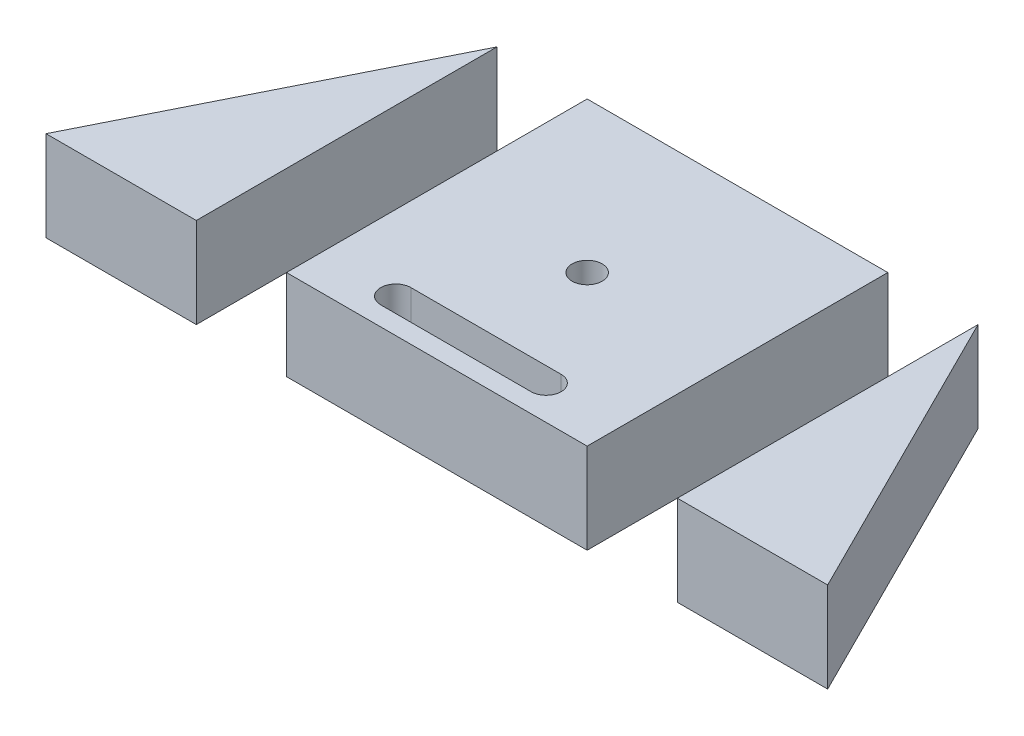
ISO-10303-21;
HEADER;
FILE_DESCRIPTION(('STEP AP214'),'2;1');
FILE_NAME('part.step','',(''),(''),'','','');
FILE_SCHEMA(('AUTOMOTIVE_DESIGN { 1 0 10303 214 1 1 1 1 }'));
ENDSEC;
DATA;
#1=APPLICATION_CONTEXT('core data for automotive mechanical design processes');
#2=APPLICATION_PROTOCOL_DEFINITION('international standard','automotive_design',2000,#1);
#3=PRODUCT_CONTEXT('',#1,'mechanical');
#4=PRODUCT('Part','Part','',(#3));
#5=PRODUCT_RELATED_PRODUCT_CATEGORY('part','',(#4));
#6=PRODUCT_DEFINITION_FORMATION('','',#4);
#7=PRODUCT_DEFINITION_CONTEXT('part definition',#1,'design');
#8=PRODUCT_DEFINITION('design','',#6,#7);
#9=PRODUCT_DEFINITION_SHAPE('','',#8);
#10=(LENGTH_UNIT() NAMED_UNIT(*) SI_UNIT(.MILLI.,.METRE.));
#11=(NAMED_UNIT(*) PLANE_ANGLE_UNIT() SI_UNIT($,.RADIAN.));
#12=(NAMED_UNIT(*) SI_UNIT($,.STERADIAN.) SOLID_ANGLE_UNIT());
#13=UNCERTAINTY_MEASURE_WITH_UNIT(LENGTH_MEASURE(1.E-05),#10,'distance_accuracy_value','');
#14=(GEOMETRIC_REPRESENTATION_CONTEXT(3) GLOBAL_UNCERTAINTY_ASSIGNED_CONTEXT((#13)) GLOBAL_UNIT_ASSIGNED_CONTEXT((#10,
#11,#12)) REPRESENTATION_CONTEXT('',''));
#15=CARTESIAN_POINT('',(0.,0.,0.));
#16=DIRECTION('',(0.,0.,1.));
#17=DIRECTION('',(1.,0.,0.));
#18=AXIS2_PLACEMENT_3D('',#15,#16,#17);
#19=CARTESIAN_POINT('',(-80.,30.,-50.));
#20=DIRECTION('',(-1.,0.,0.));
#21=DIRECTION('',(0.,0.,-1.));
#22=AXIS2_PLACEMENT_3D('',#19,#20,#21);
#23=PLANE('',#22);
#24=DIRECTION('',(0.,0.,1.));
#25=VECTOR('',#24,1.);
#26=CARTESIAN_POINT('',(-80.,0.,-50.));
#27=LINE('',#26,#25);
#28=CARTESIAN_POINT('',(-80.,0.,-50.));
#29=VERTEX_POINT('',#28);
#30=CARTESIAN_POINT('',(-80.,0.,50.));
#31=VERTEX_POINT('',#30);
#32=EDGE_CURVE('E12',#29,#31,#27,.T.);
#33=ORIENTED_EDGE('',*,*,#32,.F.);
#34=DIRECTION('',(0.,-1.,0.));
#35=VECTOR('',#34,1.);
#36=CARTESIAN_POINT('',(-80.,30.,-50.));
#37=LINE('',#36,#35);
#38=CARTESIAN_POINT('',(-80.,30.,-50.));
#39=VERTEX_POINT('',#38);
#40=EDGE_CURVE('E95',#39,#29,#37,.T.);
#41=ORIENTED_EDGE('',*,*,#40,.F.);
#42=DIRECTION('',(0.,0.,1.));
#43=VECTOR('',#42,1.);
#44=CARTESIAN_POINT('',(-80.,30.,-50.));
#45=LINE('',#44,#43);
#46=CARTESIAN_POINT('',(-80.,30.,50.));
#47=VERTEX_POINT('',#46);
#48=EDGE_CURVE('E54',#39,#47,#45,.T.);
#49=ORIENTED_EDGE('',*,*,#48,.T.);
#50=DIRECTION('',(0.,-1.,0.));
#51=VECTOR('',#50,1.);
#52=CARTESIAN_POINT('',(-80.,30.,50.));
#53=LINE('',#52,#51);
#54=EDGE_CURVE('E101',#47,#31,#53,.T.);
#55=ORIENTED_EDGE('',*,*,#54,.T.);
#56=EDGE_LOOP('',(#33,#41,#49,#55));
#57=FACE_BOUND('',#56,.T.);
#58=ADVANCED_FACE('F50',(#57),#23,.F.);
#59=CARTESIAN_POINT('',(-80.,30.,50.));
#60=DIRECTION('',(0.,0.,-1.));
#61=DIRECTION('',(1.,0.,0.));
#62=AXIS2_PLACEMENT_3D('',#59,#60,#61);
#63=PLANE('',#62);
#64=DIRECTION('',(-1.,0.,0.));
#65=VECTOR('',#64,1.);
#66=CARTESIAN_POINT('',(-80.,0.,50.));
#67=LINE('',#66,#65);
#68=CARTESIAN_POINT('',(-130.,0.,50.));
#69=VERTEX_POINT('',#68);
#70=EDGE_CURVE('E60',#31,#69,#67,.T.);
#71=ORIENTED_EDGE('',*,*,#70,.F.);
#72=ORIENTED_EDGE('',*,*,#54,.F.);
#73=DIRECTION('',(-1.,0.,0.));
#74=VECTOR('',#73,1.);
#75=CARTESIAN_POINT('',(-80.,30.,50.));
#76=LINE('',#75,#74);
#77=CARTESIAN_POINT('',(-130.,30.,50.));
#78=VERTEX_POINT('',#77);
#79=EDGE_CURVE('E85',#47,#78,#76,.T.);
#80=ORIENTED_EDGE('',*,*,#79,.T.);
#81=DIRECTION('',(0.,-1.,0.));
#82=VECTOR('',#81,1.);
#83=CARTESIAN_POINT('',(-130.,30.,50.));
#84=LINE('',#83,#82);
#85=EDGE_CURVE('E99',#78,#69,#84,.T.);
#86=ORIENTED_EDGE('',*,*,#85,.T.);
#87=EDGE_LOOP('',(#71,#72,#80,#86));
#88=FACE_BOUND('',#87,.T.);
#89=ADVANCED_FACE('F106',(#88),#63,.F.);
#90=CARTESIAN_POINT('',(-130.,30.,50.));
#91=DIRECTION('',(0.894427190999916,0.,0.447213595499958));
#92=DIRECTION('',(-0.447213595499958,0.,0.894427190999916));
#93=AXIS2_PLACEMENT_3D('',#90,#91,#92);
#94=PLANE('',#93);
#95=DIRECTION('',(0.447213595499958,0.,-0.894427190999916));
#96=VECTOR('',#95,1.);
#97=CARTESIAN_POINT('',(-130.,0.,50.));
#98=LINE('',#97,#96);
#99=EDGE_CURVE('E88',#69,#29,#98,.T.);
#100=ORIENTED_EDGE('',*,*,#99,.F.);
#101=ORIENTED_EDGE('',*,*,#85,.F.);
#102=DIRECTION('',(0.447213595499958,0.,-0.894427190999916));
#103=VECTOR('',#102,1.);
#104=CARTESIAN_POINT('',(-130.,30.,50.));
#105=LINE('',#104,#103);
#106=EDGE_CURVE('E82',#78,#39,#105,.T.);
#107=ORIENTED_EDGE('',*,*,#106,.T.);
#108=ORIENTED_EDGE('',*,*,#40,.T.);
#109=EDGE_LOOP('',(#100,#101,#107,#108));
#110=FACE_BOUND('',#109,.T.);
#111=ADVANCED_FACE('F96',(#110),#94,.F.);
#112=CARTESIAN_POINT('',(0.,30.,0.));
#113=DIRECTION('',(0.,1.,0.));
#114=DIRECTION('',(0.,0.,1.));
#115=AXIS2_PLACEMENT_3D('',#112,#113,#114);
#116=PLANE('',#115);
#117=ORIENTED_EDGE('',*,*,#48,.F.);
#118=ORIENTED_EDGE('',*,*,#106,.F.);
#119=ORIENTED_EDGE('',*,*,#79,.F.);
#120=EDGE_LOOP('',(#117,#118,#119));
#121=FACE_BOUND('',#120,.T.);
#122=ADVANCED_FACE('F52',(#121),#116,.T.);
#123=CARTESIAN_POINT('',(0.,0.,0.));
#124=DIRECTION('',(0.,1.,0.));
#125=DIRECTION('',(0.,0.,1.));
#126=AXIS2_PLACEMENT_3D('',#123,#124,#125);
#127=PLANE('',#126);
#128=ORIENTED_EDGE('',*,*,#32,.T.);
#129=ORIENTED_EDGE('',*,*,#70,.T.);
#130=ORIENTED_EDGE('',*,*,#99,.T.);
#131=EDGE_LOOP('',(#128,#129,#130));
#132=FACE_BOUND('',#131,.T.);
#133=ADVANCED_FACE('F90',(#132),#127,.F.);
#134=CLOSED_SHELL('',(#58,#89,#111,#122,#133));
#135=MANIFOLD_SOLID_BREP('B2',#134);
#136=CARTESIAN_POINT('',(80.,30.,-50.));
#137=DIRECTION('',(1.,0.,0.));
#138=DIRECTION('',(0.,0.,-1.));
#139=AXIS2_PLACEMENT_3D('',#136,#137,#138);
#140=PLANE('',#139);
#141=DIRECTION('',(0.,0.,1.));
#142=VECTOR('',#141,1.);
#143=CARTESIAN_POINT('',(80.,0.,-50.));
#144=LINE('',#143,#142);
#145=CARTESIAN_POINT('',(80.,0.,-50.));
#146=VERTEX_POINT('',#145);
#147=CARTESIAN_POINT('',(80.,0.,50.));
#148=VERTEX_POINT('',#147);
#149=EDGE_CURVE('E48',#146,#148,#144,.T.);
#150=ORIENTED_EDGE('',*,*,#149,.T.);
#151=DIRECTION('',(0.,-1.,0.));
#152=VECTOR('',#151,1.);
#153=CARTESIAN_POINT('',(80.,30.,50.));
#154=LINE('',#153,#152);
#155=CARTESIAN_POINT('',(80.,30.,50.));
#156=VERTEX_POINT('',#155);
#157=EDGE_CURVE('E267',#156,#148,#154,.T.);
#158=ORIENTED_EDGE('',*,*,#157,.F.);
#159=DIRECTION('',(0.,0.,1.));
#160=VECTOR('',#159,1.);
#161=CARTESIAN_POINT('',(80.,30.,-50.));
#162=LINE('',#161,#160);
#163=CARTESIAN_POINT('',(80.,30.,-50.));
#164=VERTEX_POINT('',#163);
#165=EDGE_CURVE('E171',#164,#156,#162,.T.);
#166=ORIENTED_EDGE('',*,*,#165,.F.);
#167=DIRECTION('',(0.,-1.,0.));
#168=VECTOR('',#167,1.);
#169=CARTESIAN_POINT('',(80.,30.,-50.));
#170=LINE('',#169,#168);
#171=EDGE_CURVE('E209',#164,#146,#170,.T.);
#172=ORIENTED_EDGE('',*,*,#171,.T.);
#173=EDGE_LOOP('',(#150,#158,#166,#172));
#174=FACE_BOUND('',#173,.T.);
#175=ADVANCED_FACE('F167',(#174),#140,.F.);
#176=CARTESIAN_POINT('',(80.,30.,50.));
#177=DIRECTION('',(0.,0.,-1.));
#178=DIRECTION('',(-1.,0.,0.));
#179=AXIS2_PLACEMENT_3D('',#176,#177,#178);
#180=PLANE('',#179);
#181=DIRECTION('',(1.,0.,0.));
#182=VECTOR('',#181,1.);
#183=CARTESIAN_POINT('',(80.,0.,50.));
#184=LINE('',#183,#182);
#185=CARTESIAN_POINT('',(130.,0.,50.));
#186=VERTEX_POINT('',#185);
#187=EDGE_CURVE('E177',#148,#186,#184,.T.);
#188=ORIENTED_EDGE('',*,*,#187,.T.);
#189=DIRECTION('',(0.,-1.,0.));
#190=VECTOR('',#189,1.);
#191=CARTESIAN_POINT('',(130.,30.,50.));
#192=LINE('',#191,#190);
#193=CARTESIAN_POINT('',(130.,30.,50.));
#194=VERTEX_POINT('',#193);
#195=EDGE_CURVE('E211',#194,#186,#192,.T.);
#196=ORIENTED_EDGE('',*,*,#195,.F.);
#197=DIRECTION('',(1.,0.,0.));
#198=VECTOR('',#197,1.);
#199=CARTESIAN_POINT('',(80.,30.,50.));
#200=LINE('',#199,#198);
#201=EDGE_CURVE('E198',#156,#194,#200,.T.);
#202=ORIENTED_EDGE('',*,*,#201,.F.);
#203=ORIENTED_EDGE('',*,*,#157,.T.);
#204=EDGE_LOOP('',(#188,#196,#202,#203));
#205=FACE_BOUND('',#204,.T.);
#206=ADVANCED_FACE('F224',(#205),#180,.F.);
#207=CARTESIAN_POINT('',(130.,30.,50.));
#208=DIRECTION('',(-0.894427190999916,0.,0.447213595499958));
#209=DIRECTION('',(0.447213595499958,0.,0.894427190999916));
#210=AXIS2_PLACEMENT_3D('',#207,#208,#209);
#211=PLANE('',#210);
#212=DIRECTION('',(-0.447213595499958,0.,-0.894427190999916));
#213=VECTOR('',#212,1.);
#214=CARTESIAN_POINT('',(130.,0.,50.));
#215=LINE('',#214,#213);
#216=EDGE_CURVE('E205',#186,#146,#215,.T.);
#217=ORIENTED_EDGE('',*,*,#216,.T.);
#218=ORIENTED_EDGE('',*,*,#171,.F.);
#219=DIRECTION('',(-0.447213595499958,0.,-0.894427190999916));
#220=VECTOR('',#219,1.);
#221=CARTESIAN_POINT('',(130.,30.,50.));
#222=LINE('',#221,#220);
#223=EDGE_CURVE('E215',#194,#164,#222,.T.);
#224=ORIENTED_EDGE('',*,*,#223,.F.);
#225=ORIENTED_EDGE('',*,*,#195,.T.);
#226=EDGE_LOOP('',(#217,#218,#224,#225));
#227=FACE_BOUND('',#226,.T.);
#228=ADVANCED_FACE('F207',(#227),#211,.F.);
#229=CARTESIAN_POINT('',(0.,30.,0.));
#230=DIRECTION('',(0.,1.,0.));
#231=DIRECTION('',(0.,0.,1.));
#232=AXIS2_PLACEMENT_3D('',#229,#230,#231);
#233=PLANE('',#232);
#234=ORIENTED_EDGE('',*,*,#165,.T.);
#235=ORIENTED_EDGE('',*,*,#201,.T.);
#236=ORIENTED_EDGE('',*,*,#223,.T.);
#237=EDGE_LOOP('',(#234,#235,#236));
#238=FACE_BOUND('',#237,.T.);
#239=ADVANCED_FACE('F169',(#238),#233,.T.);
#240=CARTESIAN_POINT('',(0.,0.,0.));
#241=DIRECTION('',(0.,1.,0.));
#242=DIRECTION('',(0.,0.,1.));
#243=AXIS2_PLACEMENT_3D('',#240,#241,#242);
#244=PLANE('',#243);
#245=ORIENTED_EDGE('',*,*,#149,.F.);
#246=ORIENTED_EDGE('',*,*,#216,.F.);
#247=ORIENTED_EDGE('',*,*,#187,.F.);
#248=EDGE_LOOP('',(#245,#246,#247));
#249=FACE_BOUND('',#248,.T.);
#250=ADVANCED_FACE('F217',(#249),#244,.F.);
#251=CLOSED_SHELL('',(#175,#206,#228,#239,#250));
#252=MANIFOLD_SOLID_BREP('B6',#251);
#253=CARTESIAN_POINT('',(50.,30.,-50.));
#254=DIRECTION('',(-1.,0.,0.));
#255=DIRECTION('',(0.,0.,1.));
#256=AXIS2_PLACEMENT_3D('',#253,#254,#255);
#257=PLANE('',#256);
#258=DIRECTION('',(0.,0.,-1.));
#259=VECTOR('',#258,1.);
#260=CARTESIAN_POINT('',(50.,0.,-50.));
#261=LINE('',#260,#259);
#262=CARTESIAN_POINT('',(50.,0.,50.));
#263=VERTEX_POINT('',#262);
#264=CARTESIAN_POINT('',(50.,0.,-50.));
#265=VERTEX_POINT('',#264);
#266=EDGE_CURVE('E384',#263,#265,#261,.T.);
#267=ORIENTED_EDGE('',*,*,#266,.T.);
#268=DIRECTION('',(0.,-1.,0.));
#269=VECTOR('',#268,1.);
#270=CARTESIAN_POINT('',(50.,30.,-50.));
#271=LINE('',#270,#269);
#272=CARTESIAN_POINT('',(50.,30.,-50.));
#273=VERTEX_POINT('',#272);
#274=EDGE_CURVE('E165',#273,#265,#271,.T.);
#275=ORIENTED_EDGE('',*,*,#274,.F.);
#276=DIRECTION('',(0.,0.,-1.));
#277=VECTOR('',#276,1.);
#278=CARTESIAN_POINT('',(50.,30.,-50.));
#279=LINE('',#278,#277);
#280=CARTESIAN_POINT('',(50.,30.,50.));
#281=VERTEX_POINT('',#280);
#282=EDGE_CURVE('E393',#281,#273,#279,.T.);
#283=ORIENTED_EDGE('',*,*,#282,.F.);
#284=DIRECTION('',(0.,-1.,0.));
#285=VECTOR('',#284,1.);
#286=CARTESIAN_POINT('',(50.,30.,50.));
#287=LINE('',#286,#285);
#288=EDGE_CURVE('E399',#281,#263,#287,.T.);
#289=ORIENTED_EDGE('',*,*,#288,.T.);
#290=EDGE_LOOP('',(#267,#275,#283,#289));
#291=FACE_BOUND('',#290,.T.);
#292=ADVANCED_FACE('F275',(#291),#257,.F.);
#293=CARTESIAN_POINT('',(-50.,30.,-50.));
#294=DIRECTION('',(0.,0.,1.));
#295=DIRECTION('',(1.,0.,0.));
#296=AXIS2_PLACEMENT_3D('',#293,#294,#295);
#297=PLANE('',#296);
#298=DIRECTION('',(-1.,0.,0.));
#299=VECTOR('',#298,1.);
#300=CARTESIAN_POINT('',(-50.,0.,-50.));
#301=LINE('',#300,#299);
#302=CARTESIAN_POINT('',(-50.,0.,-50.));
#303=VERTEX_POINT('',#302);
#304=EDGE_CURVE('E402',#265,#303,#301,.T.);
#305=ORIENTED_EDGE('',*,*,#304,.T.);
#306=DIRECTION('',(0.,-1.,0.));
#307=VECTOR('',#306,1.);
#308=CARTESIAN_POINT('',(-50.,30.,-50.));
#309=LINE('',#308,#307);
#310=CARTESIAN_POINT('',(-50.,30.,-50.));
#311=VERTEX_POINT('',#310);
#312=EDGE_CURVE('E282',#311,#303,#309,.T.);
#313=ORIENTED_EDGE('',*,*,#312,.F.);
#314=DIRECTION('',(-1.,0.,0.));
#315=VECTOR('',#314,1.);
#316=CARTESIAN_POINT('',(-50.,30.,-50.));
#317=LINE('',#316,#315);
#318=EDGE_CURVE('E326',#273,#311,#317,.T.);
#319=ORIENTED_EDGE('',*,*,#318,.F.);
#320=ORIENTED_EDGE('',*,*,#274,.T.);
#321=EDGE_LOOP('',(#305,#313,#319,#320));
#322=FACE_BOUND('',#321,.T.);
#323=ADVANCED_FACE('F431',(#322),#297,.F.);
#324=CARTESIAN_POINT('',(-50.,30.,-50.));
#325=DIRECTION('',(1.,0.,0.));
#326=DIRECTION('',(0.,0.,-1.));
#327=AXIS2_PLACEMENT_3D('',#324,#325,#326);
#328=PLANE('',#327);
#329=DIRECTION('',(0.,0.,1.));
#330=VECTOR('',#329,1.);
#331=CARTESIAN_POINT('',(-50.,0.,-50.));
#332=LINE('',#331,#330);
#333=CARTESIAN_POINT('',(-50.,0.,50.));
#334=VERTEX_POINT('',#333);
#335=EDGE_CURVE('E404',#303,#334,#332,.T.);
#336=ORIENTED_EDGE('',*,*,#335,.T.);
#337=DIRECTION('',(0.,-1.,0.));
#338=VECTOR('',#337,1.);
#339=CARTESIAN_POINT('',(-50.,30.,50.));
#340=LINE('',#339,#338);
#341=CARTESIAN_POINT('',(-50.,30.,50.));
#342=VERTEX_POINT('',#341);
#343=EDGE_CURVE('E408',#342,#334,#340,.T.);
#344=ORIENTED_EDGE('',*,*,#343,.F.);
#345=DIRECTION('',(0.,0.,1.));
#346=VECTOR('',#345,1.);
#347=CARTESIAN_POINT('',(-50.,30.,-50.));
#348=LINE('',#347,#346);
#349=EDGE_CURVE('E396',#311,#342,#348,.T.);
#350=ORIENTED_EDGE('',*,*,#349,.F.);
#351=ORIENTED_EDGE('',*,*,#312,.T.);
#352=EDGE_LOOP('',(#336,#344,#350,#351));
#353=FACE_BOUND('',#352,.T.);
#354=ADVANCED_FACE('F413',(#353),#328,.F.);
#355=CARTESIAN_POINT('',(-50.,30.,50.));
#356=DIRECTION('',(0.,0.,-1.));
#357=DIRECTION('',(-1.,0.,0.));
#358=AXIS2_PLACEMENT_3D('',#355,#356,#357);
#359=PLANE('',#358);
#360=DIRECTION('',(1.,0.,0.));
#361=VECTOR('',#360,1.);
#362=CARTESIAN_POINT('',(-50.,0.,50.));
#363=LINE('',#362,#361);
#364=EDGE_CURVE('E319',#334,#263,#363,.T.);
#365=ORIENTED_EDGE('',*,*,#364,.T.);
#366=ORIENTED_EDGE('',*,*,#288,.F.);
#367=DIRECTION('',(1.,0.,0.));
#368=VECTOR('',#367,1.);
#369=CARTESIAN_POINT('',(-50.,30.,50.));
#370=LINE('',#369,#368);
#371=EDGE_CURVE('E298',#342,#281,#370,.T.);
#372=ORIENTED_EDGE('',*,*,#371,.F.);
#373=ORIENTED_EDGE('',*,*,#343,.T.);
#374=EDGE_LOOP('',(#365,#366,#372,#373));
#375=FACE_BOUND('',#374,.T.);
#376=ADVANCED_FACE('F421',(#375),#359,.F.);
#377=CARTESIAN_POINT('',(0.,30.,0.));
#378=DIRECTION('',(0.,1.,0.));
#379=DIRECTION('',(0.,0.,1.));
#380=AXIS2_PLACEMENT_3D('',#377,#378,#379);
#381=PLANE('',#380);
#382=CARTESIAN_POINT('',(-25.,30.,38.649292644236));
#383=DIRECTION('',(0.,1.,0.));
#384=DIRECTION('',(0.,0.,1.));
#385=AXIS2_PLACEMENT_3D('',#382,#383,#384);
#386=CIRCLE('',#385,5.);
#387=CARTESIAN_POINT('',(-25.,30.,33.649292644236));
#388=VERTEX_POINT('',#387);
#389=CARTESIAN_POINT('',(-25.,30.,43.649292644236));
#390=VERTEX_POINT('',#389);
#391=EDGE_CURVE('E289',#388,#390,#386,.T.);
#392=ORIENTED_EDGE('',*,*,#391,.F.);
#393=DIRECTION('',(-1.,0.,0.));
#394=VECTOR('',#393,1.);
#395=CARTESIAN_POINT('',(-25.,30.,33.649292644236));
#396=LINE('',#395,#394);
#397=CARTESIAN_POINT('',(25.,30.,33.6492926442359));
#398=VERTEX_POINT('',#397);
#399=EDGE_CURVE('E368',#398,#388,#396,.T.);
#400=ORIENTED_EDGE('',*,*,#399,.F.);
#401=CARTESIAN_POINT('',(25.,30.,38.6492926442359));
#402=DIRECTION('',(0.,1.,0.));
#403=DIRECTION('',(0.,0.,1.));
#404=AXIS2_PLACEMENT_3D('',#401,#402,#403);
#405=CIRCLE('',#404,5.);
#406=CARTESIAN_POINT('',(25.,30.,43.649292644236));
#407=VERTEX_POINT('',#406);
#408=EDGE_CURVE('E371',#407,#398,#405,.T.);
#409=ORIENTED_EDGE('',*,*,#408,.F.);
#410=DIRECTION('',(1.,0.,0.));
#411=VECTOR('',#410,1.);
#412=CARTESIAN_POINT('',(-25.,30.,43.649292644236));
#413=LINE('',#412,#411);
#414=EDGE_CURVE('E377',#390,#407,#413,.T.);
#415=ORIENTED_EDGE('',*,*,#414,.F.);
#416=EDGE_LOOP('',(#392,#400,#409,#415));
#417=FACE_BOUND('',#416,.T.);
#418=CARTESIAN_POINT('',(0.,30.,0.));
#419=DIRECTION('',(0.,1.,0.));
#420=DIRECTION('',(0.,0.,1.));
#421=AXIS2_PLACEMENT_3D('',#418,#419,#420);
#422=CIRCLE('',#421,5.);
#423=CARTESIAN_POINT('',(0.,30.,5.));
#424=VERTEX_POINT('',#423);
#425=EDGE_CURVE('E378',#424,#424,#422,.T.);
#426=ORIENTED_EDGE('',*,*,#425,.F.);
#427=EDGE_LOOP('',(#426));
#428=FACE_BOUND('',#427,.T.);
#429=ORIENTED_EDGE('',*,*,#282,.T.);
#430=ORIENTED_EDGE('',*,*,#318,.T.);
#431=ORIENTED_EDGE('',*,*,#349,.T.);
#432=ORIENTED_EDGE('',*,*,#371,.T.);
#433=EDGE_LOOP('',(#429,#430,#431,#432));
#434=FACE_BOUND('',#433,.T.);
#435=ADVANCED_FACE('F423',(#417,#428,#434),#381,.T.);
#436=CARTESIAN_POINT('',(0.,0.,0.));
#437=DIRECTION('',(0.,1.,0.));
#438=DIRECTION('',(0.,0.,1.));
#439=AXIS2_PLACEMENT_3D('',#436,#437,#438);
#440=PLANE('',#439);
#441=ORIENTED_EDGE('',*,*,#266,.F.);
#442=ORIENTED_EDGE('',*,*,#364,.F.);
#443=ORIENTED_EDGE('',*,*,#335,.F.);
#444=ORIENTED_EDGE('',*,*,#304,.F.);
#445=EDGE_LOOP('',(#441,#442,#443,#444));
#446=FACE_BOUND('',#445,.T.);
#447=ADVANCED_FACE('F417',(#446),#440,.F.);
#448=CARTESIAN_POINT('',(0.,20.,0.));
#449=DIRECTION('',(0.,1.,0.));
#450=DIRECTION('',(0.,0.,1.));
#451=AXIS2_PLACEMENT_3D('',#448,#449,#450);
#452=CYLINDRICAL_SURFACE('',#451,5.);
#453=CARTESIAN_POINT('',(0.,20.,0.));
#454=DIRECTION('',(0.,1.,0.));
#455=DIRECTION('',(0.,0.,1.));
#456=AXIS2_PLACEMENT_3D('',#453,#454,#455);
#457=CIRCLE('',#456,5.);
#458=CARTESIAN_POINT('',(0.,20.,5.));
#459=VERTEX_POINT('',#458);
#460=EDGE_CURVE('E390',#459,#459,#457,.T.);
#461=ORIENTED_EDGE('',*,*,#460,.F.);
#462=EDGE_LOOP('',(#461));
#463=FACE_BOUND('',#462,.T.);
#464=ORIENTED_EDGE('',*,*,#425,.T.);
#465=EDGE_LOOP('',(#464));
#466=FACE_BOUND('',#465,.T.);
#467=ADVANCED_FACE('F460',(#463,#466),#452,.F.);
#468=CARTESIAN_POINT('',(0.,20.,0.));
#469=DIRECTION('',(0.,1.,0.));
#470=DIRECTION('',(0.,0.,1.));
#471=AXIS2_PLACEMENT_3D('',#468,#469,#470);
#472=PLANE('',#471);
#473=ORIENTED_EDGE('',*,*,#460,.T.);
#474=EDGE_LOOP('',(#473));
#475=FACE_BOUND('',#474,.T.);
#476=ADVANCED_FACE('F475',(#475),#472,.T.);
#477=CARTESIAN_POINT('',(-25.,20.,38.649292644236));
#478=DIRECTION('',(0.,1.,0.));
#479=DIRECTION('',(0.,0.,1.));
#480=AXIS2_PLACEMENT_3D('',#477,#478,#479);
#481=CYLINDRICAL_SURFACE('',#480,5.);
#482=ORIENTED_EDGE('',*,*,#391,.T.);
#483=DIRECTION('',(0.,1.,0.));
#484=VECTOR('',#483,1.);
#485=CARTESIAN_POINT('',(-25.,20.,43.649292644236));
#486=LINE('',#485,#484);
#487=CARTESIAN_POINT('',(-25.,20.,43.649292644236));
#488=VERTEX_POINT('',#487);
#489=EDGE_CURVE('E346',#488,#390,#486,.T.);
#490=ORIENTED_EDGE('',*,*,#489,.F.);
#491=CARTESIAN_POINT('',(-25.,20.,38.649292644236));
#492=DIRECTION('',(0.,1.,0.));
#493=DIRECTION('',(0.,0.,1.));
#494=AXIS2_PLACEMENT_3D('',#491,#492,#493);
#495=CIRCLE('',#494,5.);
#496=CARTESIAN_POINT('',(-25.,20.,33.649292644236));
#497=VERTEX_POINT('',#496);
#498=EDGE_CURVE('E350',#497,#488,#495,.T.);
#499=ORIENTED_EDGE('',*,*,#498,.F.);
#500=DIRECTION('',(0.,1.,0.));
#501=VECTOR('',#500,1.);
#502=CARTESIAN_POINT('',(-25.,20.,33.649292644236));
#503=LINE('',#502,#501);
#504=EDGE_CURVE('E382',#497,#388,#503,.T.);
#505=ORIENTED_EDGE('',*,*,#504,.T.);
#506=EDGE_LOOP('',(#482,#490,#499,#505));
#507=FACE_BOUND('',#506,.T.);
#508=ADVANCED_FACE('F348',(#507),#481,.F.);
#509=CARTESIAN_POINT('',(-25.,20.,33.649292644236));
#510=DIRECTION('',(0.,0.,-1.));
#511=DIRECTION('',(-1.,0.,0.));
#512=AXIS2_PLACEMENT_3D('',#509,#510,#511);
#513=PLANE('',#512);
#514=ORIENTED_EDGE('',*,*,#399,.T.);
#515=ORIENTED_EDGE('',*,*,#504,.F.);
#516=DIRECTION('',(-1.,0.,0.));
#517=VECTOR('',#516,1.);
#518=CARTESIAN_POINT('',(-25.,20.,33.649292644236));
#519=LINE('',#518,#517);
#520=CARTESIAN_POINT('',(25.,20.,33.6492926442359));
#521=VERTEX_POINT('',#520);
#522=EDGE_CURVE('E356',#521,#497,#519,.T.);
#523=ORIENTED_EDGE('',*,*,#522,.F.);
#524=DIRECTION('',(0.,1.,0.));
#525=VECTOR('',#524,1.);
#526=CARTESIAN_POINT('',(25.,20.,33.6492926442359));
#527=LINE('',#526,#525);
#528=EDGE_CURVE('E385',#521,#398,#527,.T.);
#529=ORIENTED_EDGE('',*,*,#528,.T.);
#530=EDGE_LOOP('',(#514,#515,#523,#529));
#531=FACE_BOUND('',#530,.T.);
#532=ADVANCED_FACE('F496',(#531),#513,.F.);
#533=CARTESIAN_POINT('',(25.,20.,38.6492926442359));
#534=DIRECTION('',(0.,1.,0.));
#535=DIRECTION('',(0.,0.,1.));
#536=AXIS2_PLACEMENT_3D('',#533,#534,#535);
#537=CYLINDRICAL_SURFACE('',#536,5.);
#538=ORIENTED_EDGE('',*,*,#408,.T.);
#539=ORIENTED_EDGE('',*,*,#528,.F.);
#540=CARTESIAN_POINT('',(25.,20.,38.6492926442359));
#541=DIRECTION('',(0.,1.,0.));
#542=DIRECTION('',(0.,0.,1.));
#543=AXIS2_PLACEMENT_3D('',#540,#541,#542);
#544=CIRCLE('',#543,5.);
#545=CARTESIAN_POINT('',(25.,20.,43.649292644236));
#546=VERTEX_POINT('',#545);
#547=EDGE_CURVE('E364',#546,#521,#544,.T.);
#548=ORIENTED_EDGE('',*,*,#547,.F.);
#549=DIRECTION('',(0.,1.,0.));
#550=VECTOR('',#549,1.);
#551=CARTESIAN_POINT('',(25.,20.,43.649292644236));
#552=LINE('',#551,#550);
#553=EDGE_CURVE('E355',#546,#407,#552,.T.);
#554=ORIENTED_EDGE('',*,*,#553,.T.);
#555=EDGE_LOOP('',(#538,#539,#548,#554));
#556=FACE_BOUND('',#555,.T.);
#557=ADVANCED_FACE('F506',(#556),#537,.F.);
#558=CARTESIAN_POINT('',(-25.,20.,43.649292644236));
#559=DIRECTION('',(0.,0.,1.));
#560=DIRECTION('',(1.,0.,0.));
#561=AXIS2_PLACEMENT_3D('',#558,#559,#560);
#562=PLANE('',#561);
#563=ORIENTED_EDGE('',*,*,#414,.T.);
#564=ORIENTED_EDGE('',*,*,#553,.F.);
#565=DIRECTION('',(1.,0.,0.));
#566=VECTOR('',#565,1.);
#567=CARTESIAN_POINT('',(-25.,20.,43.649292644236));
#568=LINE('',#567,#566);
#569=EDGE_CURVE('E359',#488,#546,#568,.T.);
#570=ORIENTED_EDGE('',*,*,#569,.F.);
#571=ORIENTED_EDGE('',*,*,#489,.T.);
#572=EDGE_LOOP('',(#563,#564,#570,#571));
#573=FACE_BOUND('',#572,.T.);
#574=ADVANCED_FACE('F360',(#573),#562,.F.);
#575=CARTESIAN_POINT('',(-25.,20.,38.649292644236));
#576=DIRECTION('',(0.,1.,0.));
#577=DIRECTION('',(0.,0.,1.));
#578=AXIS2_PLACEMENT_3D('',#575,#576,#577);
#579=PLANE('',#578);
#580=ORIENTED_EDGE('',*,*,#498,.T.);
#581=ORIENTED_EDGE('',*,*,#569,.T.);
#582=ORIENTED_EDGE('',*,*,#547,.T.);
#583=ORIENTED_EDGE('',*,*,#522,.T.);
#584=EDGE_LOOP('',(#580,#581,#582,#583));
#585=FACE_BOUND('',#584,.T.);
#586=ADVANCED_FACE('F366',(#585),#579,.T.);
#587=CLOSED_SHELL('',(#292,#323,#354,#376,#435,#447,#467,#476,#508,#532,#557,#574,#586));
#588=MANIFOLD_SOLID_BREP('B42',#587);
#589=ADVANCED_BREP_SHAPE_REPRESENTATION('',(#18,#135,#252,#588),#14);
#590=SHAPE_DEFINITION_REPRESENTATION(#9,#589);
ENDSEC;
END-ISO-10303-21;
